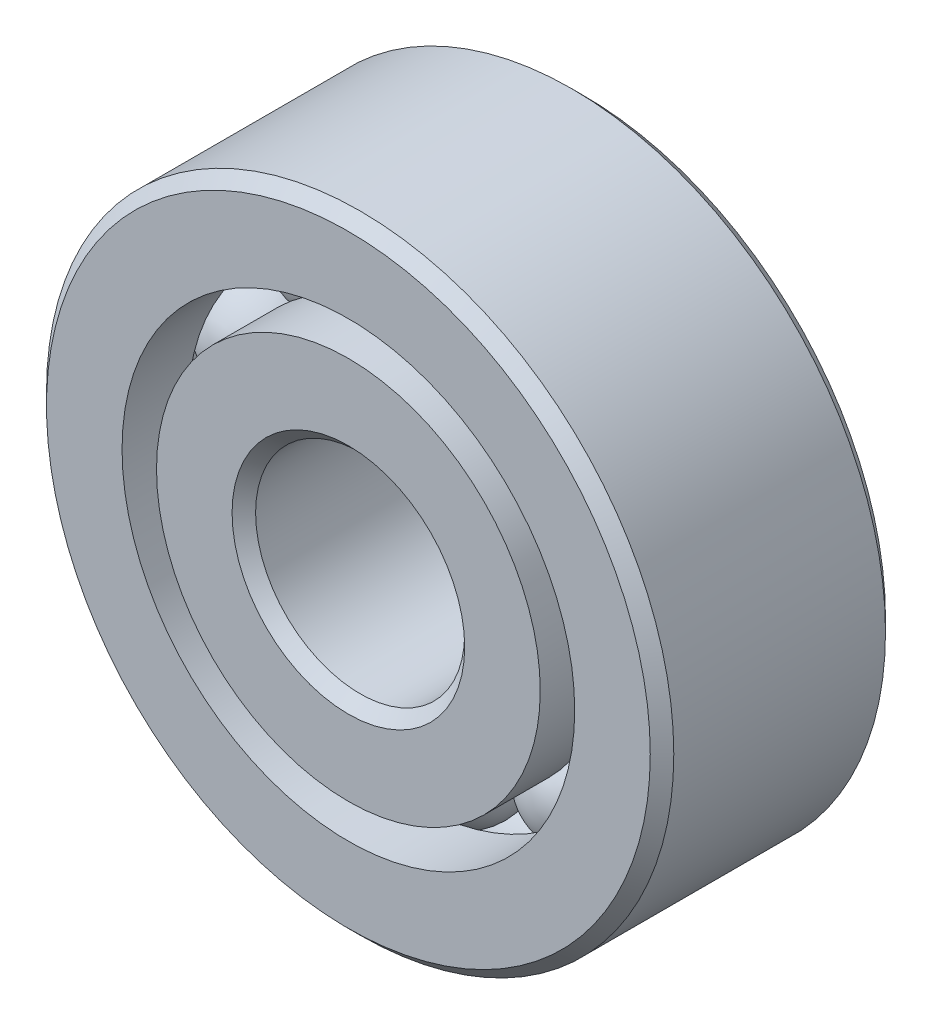
ISO-10303-21;
HEADER;
FILE_DESCRIPTION(('STEP AP214'),'2;1');
FILE_NAME('part.step','',(''),(''),'','','');
FILE_SCHEMA(('AUTOMOTIVE_DESIGN { 1 0 10303 214 1 1 1 1 }'));
ENDSEC;
DATA;
#1=APPLICATION_CONTEXT('core data for automotive mechanical design processes');
#2=APPLICATION_PROTOCOL_DEFINITION('international standard','automotive_design',2000,#1);
#3=PRODUCT_CONTEXT('',#1,'mechanical');
#4=PRODUCT('Part','Part','',(#3));
#5=PRODUCT_RELATED_PRODUCT_CATEGORY('part','',(#4));
#6=PRODUCT_DEFINITION_FORMATION('','',#4);
#7=PRODUCT_DEFINITION_CONTEXT('part definition',#1,'design');
#8=PRODUCT_DEFINITION('design','',#6,#7);
#9=PRODUCT_DEFINITION_SHAPE('','',#8);
#10=(LENGTH_UNIT() NAMED_UNIT(*) SI_UNIT(.MILLI.,.METRE.));
#11=(NAMED_UNIT(*) PLANE_ANGLE_UNIT() SI_UNIT($,.RADIAN.));
#12=(NAMED_UNIT(*) SI_UNIT($,.STERADIAN.) SOLID_ANGLE_UNIT());
#13=UNCERTAINTY_MEASURE_WITH_UNIT(LENGTH_MEASURE(1.E-05),#10,'distance_accuracy_value','');
#14=(GEOMETRIC_REPRESENTATION_CONTEXT(3) GLOBAL_UNCERTAINTY_ASSIGNED_CONTEXT((#13)) GLOBAL_UNIT_ASSIGNED_CONTEXT((#10,
#11,#12)) REPRESENTATION_CONTEXT('',''));
#15=CARTESIAN_POINT('',(0.,0.,0.));
#16=DIRECTION('',(0.,0.,1.));
#17=DIRECTION('',(1.,0.,0.));
#18=AXIS2_PLACEMENT_3D('',#15,#16,#17);
#19=CARTESIAN_POINT('',(-3.73243635205714,5.13725791428097,0.));
#20=DIRECTION('',(0.,0.,1.));
#21=DIRECTION('',(-0.587785252292462,0.809016994374955,0.));
#22=AXIS2_PLACEMENT_3D('',#19,#20,#21);
#23=SPHERICAL_SURFACE('',#22,1.67154216154795);
#24=CARTESIAN_POINT('',(-3.73243635205714,5.13725791428097,1.67154216154795));
#25=VERTEX_POINT('',#24);
#26=VERTEX_LOOP('',#25);
#27=FACE_BOUND('',#26,.T.);
#28=ADVANCED_FACE('F37',(#27),#23,.T.);
#29=CLOSED_SHELL('',(#28));
#30=MANIFOLD_SOLID_BREP('B2',#29);
#31=CARTESIAN_POINT('',(-6.0392088784742,1.96225791428099,0.));
#32=DIRECTION('',(0.,0.,1.));
#33=DIRECTION('',(-0.95105651629515,0.309016994374958,0.));
#34=AXIS2_PLACEMENT_3D('',#31,#32,#33);
#35=SPHERICAL_SURFACE('',#34,1.67154216154795);
#36=CARTESIAN_POINT('',(-6.0392088784742,1.96225791428099,1.67154216154795));
#37=VERTEX_POINT('',#36);
#38=VERTEX_LOOP('',#37);
#39=FACE_BOUND('',#38,.T.);
#40=ADVANCED_FACE('F57',(#39),#35,.T.);
#41=CLOSED_SHELL('',(#40));
#42=MANIFOLD_SOLID_BREP('B6',#41);
#43=CARTESIAN_POINT('',(-6.03920887847425,-1.96225791428086,0.));
#44=DIRECTION('',(0.,0.,1.));
#45=DIRECTION('',(-0.951056516295157,-0.309016994374938,0.));
#46=AXIS2_PLACEMENT_3D('',#43,#44,#45);
#47=SPHERICAL_SURFACE('',#46,1.67154216154795);
#48=CARTESIAN_POINT('',(-6.03920887847425,-1.96225791428086,1.67154216154795));
#49=VERTEX_POINT('',#48);
#50=VERTEX_LOOP('',#49);
#51=FACE_BOUND('',#50,.T.);
#52=ADVANCED_FACE('F77',(#51),#47,.T.);
#53=CLOSED_SHELL('',(#52));
#54=MANIFOLD_SOLID_BREP('B33',#53);
#55=CARTESIAN_POINT('',(-3.73243635205725,-5.13725791428089,0.));
#56=DIRECTION('',(0.,0.,1.));
#57=DIRECTION('',(-0.58778525229248,-0.809016994374942,0.));
#58=AXIS2_PLACEMENT_3D('',#55,#56,#57);
#59=SPHERICAL_SURFACE('',#58,1.67154216154795);
#60=CARTESIAN_POINT('',(-3.73243635205725,-5.13725791428089,1.67154216154795));
#61=VERTEX_POINT('',#60);
#62=VERTEX_LOOP('',#61);
#63=FACE_BOUND('',#62,.T.);
#64=ADVANCED_FACE('F97',(#63),#59,.T.);
#65=CLOSED_SHELL('',(#64));
#66=MANIFOLD_SOLID_BREP('B53',#65);
#67=CARTESIAN_POINT('',(0.,-6.35,0.));
#68=DIRECTION('',(0.,0.,1.));
#69=DIRECTION('',(0.,-1.,0.));
#70=AXIS2_PLACEMENT_3D('',#67,#68,#69);
#71=SPHERICAL_SURFACE('',#70,1.67154216154795);
#72=CARTESIAN_POINT('',(0.,-6.35,1.67154216154795));
#73=VERTEX_POINT('',#72);
#74=VERTEX_LOOP('',#73);
#75=FACE_BOUND('',#74,.T.);
#76=ADVANCED_FACE('F117',(#75),#71,.T.);
#77=CLOSED_SHELL('',(#76));
#78=MANIFOLD_SOLID_BREP('B73',#77);
#79=CARTESIAN_POINT('',(3.73243635205718,-5.13725791428094,0.));
#80=DIRECTION('',(0.,0.,1.));
#81=DIRECTION('',(0.587785252292469,-0.809016994374951,0.));
#82=AXIS2_PLACEMENT_3D('',#79,#80,#81);
#83=SPHERICAL_SURFACE('',#82,1.67154216154795);
#84=CARTESIAN_POINT('',(3.73243635205718,-5.13725791428094,1.67154216154795));
#85=VERTEX_POINT('',#84);
#86=VERTEX_LOOP('',#85);
#87=FACE_BOUND('',#86,.T.);
#88=ADVANCED_FACE('F137',(#87),#83,.T.);
#89=CLOSED_SHELL('',(#88));
#90=MANIFOLD_SOLID_BREP('B93',#89);
#91=CARTESIAN_POINT('',(6.03920887847422,-1.96225791428094,0.));
#92=DIRECTION('',(0.,0.,1.));
#93=DIRECTION('',(0.951056516295152,-0.309016994374952,0.));
#94=AXIS2_PLACEMENT_3D('',#91,#92,#93);
#95=SPHERICAL_SURFACE('',#94,1.67154216154795);
#96=CARTESIAN_POINT('',(6.03920887847422,-1.96225791428094,1.67154216154795));
#97=VERTEX_POINT('',#96);
#98=VERTEX_LOOP('',#97);
#99=FACE_BOUND('',#98,.T.);
#100=ADVANCED_FACE('F157',(#99),#95,.T.);
#101=CLOSED_SHELL('',(#100));
#102=MANIFOLD_SOLID_BREP('B113',#101);
#103=CARTESIAN_POINT('',(6.03920887847423,1.9622579142809,0.));
#104=DIRECTION('',(0.,0.,1.));
#105=DIRECTION('',(0.951056516295155,0.309016994374945,0.));
#106=AXIS2_PLACEMENT_3D('',#103,#104,#105);
#107=SPHERICAL_SURFACE('',#106,1.67154216154795);
#108=CARTESIAN_POINT('',(6.03920887847423,1.9622579142809,1.67154216154795));
#109=VERTEX_POINT('',#108);
#110=VERTEX_LOOP('',#109);
#111=FACE_BOUND('',#110,.T.);
#112=ADVANCED_FACE('F177',(#111),#107,.T.);
#113=CLOSED_SHELL('',(#112));
#114=MANIFOLD_SOLID_BREP('B133',#113);
#115=CARTESIAN_POINT('',(3.73243635205721,5.13725791428091,0.));
#116=DIRECTION('',(0.,0.,1.));
#117=DIRECTION('',(0.587785252292474,0.809016994374947,0.));
#118=AXIS2_PLACEMENT_3D('',#115,#116,#117);
#119=SPHERICAL_SURFACE('',#118,1.67154216154795);
#120=CARTESIAN_POINT('',(3.73243635205721,5.13725791428091,1.67154216154795));
#121=VERTEX_POINT('',#120);
#122=VERTEX_LOOP('',#121);
#123=FACE_BOUND('',#122,.T.);
#124=ADVANCED_FACE('F197',(#123),#119,.T.);
#125=CLOSED_SHELL('',(#124));
#126=MANIFOLD_SOLID_BREP('B153',#125);
#127=CARTESIAN_POINT('',(0.,6.35,0.));
#128=DIRECTION('',(0.,0.,1.));
#129=DIRECTION('',(0.,1.,0.));
#130=AXIS2_PLACEMENT_3D('',#127,#128,#129);
#131=SPHERICAL_SURFACE('',#130,1.67154216154795);
#132=CARTESIAN_POINT('',(0.,6.35,1.67154216154795));
#133=VERTEX_POINT('',#132);
#134=VERTEX_LOOP('',#133);
#135=FACE_BOUND('',#134,.T.);
#136=ADVANCED_FACE('F220',(#135),#131,.T.);
#137=CLOSED_SHELL('',(#136));
#138=MANIFOLD_SOLID_BREP('B173',#137);
#139=CARTESIAN_POINT('',(0.,5.82664835164835,3.571875));
#140=DIRECTION('',(0.,0.,-1.));
#141=DIRECTION('',(-1.,0.,0.));
#142=AXIS2_PLACEMENT_3D('',#139,#140,#141);
#143=PLANE('',#142);
#144=CARTESIAN_POINT('',(0.,0.,3.571875));
#145=DIRECTION('',(0.,0.,1.));
#146=DIRECTION('',(1.,0.,0.));
#147=AXIS2_PLACEMENT_3D('',#144,#145,#146);
#148=CIRCLE('',#147,3.5321875);
#149=CARTESIAN_POINT('',(3.5321875,0.,3.571875));
#150=VERTEX_POINT('',#149);
#151=EDGE_CURVE('E268',#150,#150,#148,.T.);
#152=ORIENTED_EDGE('',*,*,#151,.F.);
#153=EDGE_LOOP('',(#152));
#154=FACE_BOUND('',#153,.T.);
#155=CARTESIAN_POINT('',(0.,0.,3.571875));
#156=DIRECTION('',(0.,0.,1.));
#157=DIRECTION('',(1.,0.,0.));
#158=AXIS2_PLACEMENT_3D('',#155,#156,#157);
#159=CIRCLE('',#158,5.82664835164835);
#160=CARTESIAN_POINT('',(5.82664835164835,0.,3.571875));
#161=VERTEX_POINT('',#160);
#162=EDGE_CURVE('E219',#161,#161,#159,.T.);
#163=ORIENTED_EDGE('',*,*,#162,.T.);
#164=EDGE_LOOP('',(#163));
#165=FACE_BOUND('',#164,.T.);
#166=ADVANCED_FACE('F240',(#154,#165),#143,.F.);
#167=CARTESIAN_POINT('',(0.,0.,3.571875));
#168=DIRECTION('',(0.,0.,1.));
#169=DIRECTION('',(1.,0.,0.));
#170=AXIS2_PLACEMENT_3D('',#167,#168,#169);
#171=CYLINDRICAL_SURFACE('',#170,5.82664835164835);
#172=ORIENTED_EDGE('',*,*,#162,.F.);
#173=EDGE_LOOP('',(#172));
#174=FACE_BOUND('',#173,.T.);
#175=CARTESIAN_POINT('',(0.,0.,1.5875));
#176=DIRECTION('',(0.,0.,1.));
#177=DIRECTION('',(1.,0.,0.));
#178=AXIS2_PLACEMENT_3D('',#175,#176,#177);
#179=CIRCLE('',#178,5.82664835164835);
#180=CARTESIAN_POINT('',(5.82664835164835,0.,1.5875));
#181=VERTEX_POINT('',#180);
#182=EDGE_CURVE('E246',#181,#181,#179,.T.);
#183=ORIENTED_EDGE('',*,*,#182,.T.);
#184=EDGE_LOOP('',(#183));
#185=FACE_BOUND('',#184,.T.);
#186=ADVANCED_FACE('F275',(#174,#185),#171,.T.);
#187=CARTESIAN_POINT('',(0.,0.,0.));
#188=DIRECTION('',(0.,0.,1.));
#189=DIRECTION('',(1.,0.,0.));
#190=AXIS2_PLACEMENT_3D('',#187,#188,#189);
#191=TOROIDAL_SURFACE('',#190,6.34999999999999,1.67154216154794);
#192=ORIENTED_EDGE('',*,*,#182,.F.);
#193=EDGE_LOOP('',(#192));
#194=FACE_BOUND('',#193,.T.);
#195=CARTESIAN_POINT('',(0.,0.,-1.5875));
#196=DIRECTION('',(0.,0.,1.));
#197=DIRECTION('',(1.,0.,0.));
#198=AXIS2_PLACEMENT_3D('',#195,#196,#197);
#199=CIRCLE('',#198,5.82664835164835);
#200=CARTESIAN_POINT('',(5.82664835164835,0.,-1.5875));
#201=VERTEX_POINT('',#200);
#202=EDGE_CURVE('E250',#201,#201,#199,.T.);
#203=ORIENTED_EDGE('',*,*,#202,.T.);
#204=EDGE_LOOP('',(#203));
#205=FACE_BOUND('',#204,.T.);
#206=ADVANCED_FACE('F279',(#194,#205),#191,.F.);
#207=CARTESIAN_POINT('',(0.,0.,3.571875));
#208=DIRECTION('',(0.,0.,1.));
#209=DIRECTION('',(1.,0.,0.));
#210=AXIS2_PLACEMENT_3D('',#207,#208,#209);
#211=CYLINDRICAL_SURFACE('',#210,5.82664835164835);
#212=ORIENTED_EDGE('',*,*,#202,.F.);
#213=EDGE_LOOP('',(#212));
#214=FACE_BOUND('',#213,.T.);
#215=CARTESIAN_POINT('',(0.,0.,-3.571875));
#216=DIRECTION('',(0.,0.,1.));
#217=DIRECTION('',(1.,0.,0.));
#218=AXIS2_PLACEMENT_3D('',#215,#216,#217);
#219=CIRCLE('',#218,5.82664835164835);
#220=CARTESIAN_POINT('',(5.82664835164835,0.,-3.571875));
#221=VERTEX_POINT('',#220);
#222=EDGE_CURVE('E254',#221,#221,#219,.T.);
#223=ORIENTED_EDGE('',*,*,#222,.T.);
#224=EDGE_LOOP('',(#223));
#225=FACE_BOUND('',#224,.T.);
#226=ADVANCED_FACE('F284',(#214,#225),#211,.T.);
#227=CARTESIAN_POINT('',(0.,3.5321875,-3.571875));
#228=DIRECTION('',(0.,0.,1.));
#229=DIRECTION('',(1.,0.,0.));
#230=AXIS2_PLACEMENT_3D('',#227,#228,#229);
#231=PLANE('',#230);
#232=ORIENTED_EDGE('',*,*,#222,.F.);
#233=EDGE_LOOP('',(#232));
#234=FACE_BOUND('',#233,.T.);
#235=CARTESIAN_POINT('',(0.,0.,-3.57187500000001));
#236=DIRECTION('',(0.,0.,1.));
#237=DIRECTION('',(1.,0.,0.));
#238=AXIS2_PLACEMENT_3D('',#235,#236,#237);
#239=CIRCLE('',#238,3.5321875);
#240=CARTESIAN_POINT('',(3.5321875,0.,-3.57187500000001));
#241=VERTEX_POINT('',#240);
#242=EDGE_CURVE('E259',#241,#241,#239,.T.);
#243=ORIENTED_EDGE('',*,*,#242,.T.);
#244=EDGE_LOOP('',(#243));
#245=FACE_BOUND('',#244,.T.);
#246=ADVANCED_FACE('F290',(#234,#245),#231,.F.);
#247=CARTESIAN_POINT('',(0.,0.,-3.2146875));
#248=DIRECTION('',(0.,0.,-1.));
#249=DIRECTION('',(-1.,0.,0.));
#250=AXIS2_PLACEMENT_3D('',#247,#248,#249);
#251=CONICAL_SURFACE('',#250,3.175,0.785398163397445);
#252=ORIENTED_EDGE('',*,*,#242,.F.);
#253=EDGE_LOOP('',(#252));
#254=FACE_BOUND('',#253,.T.);
#255=CARTESIAN_POINT('',(0.,0.,-3.2146875));
#256=DIRECTION('',(0.,0.,1.));
#257=DIRECTION('',(1.,0.,0.));
#258=AXIS2_PLACEMENT_3D('',#255,#256,#257);
#259=CIRCLE('',#258,3.175);
#260=CARTESIAN_POINT('',(3.175,0.,-3.2146875));
#261=VERTEX_POINT('',#260);
#262=EDGE_CURVE('E262',#261,#261,#259,.T.);
#263=ORIENTED_EDGE('',*,*,#262,.T.);
#264=EDGE_LOOP('',(#263));
#265=FACE_BOUND('',#264,.T.);
#266=ADVANCED_FACE('F294',(#254,#265),#251,.F.);
#267=CARTESIAN_POINT('',(0.,0.,3.571875));
#268=DIRECTION('',(0.,0.,1.));
#269=DIRECTION('',(1.,0.,0.));
#270=AXIS2_PLACEMENT_3D('',#267,#268,#269);
#271=CYLINDRICAL_SURFACE('',#270,3.175);
#272=ORIENTED_EDGE('',*,*,#262,.F.);
#273=EDGE_LOOP('',(#272));
#274=FACE_BOUND('',#273,.T.);
#275=CARTESIAN_POINT('',(0.,0.,3.21468750000001));
#276=DIRECTION('',(0.,0.,1.));
#277=DIRECTION('',(1.,0.,0.));
#278=AXIS2_PLACEMENT_3D('',#275,#276,#277);
#279=CIRCLE('',#278,3.175);
#280=CARTESIAN_POINT('',(3.175,0.,3.21468750000001));
#281=VERTEX_POINT('',#280);
#282=EDGE_CURVE('E265',#281,#281,#279,.T.);
#283=ORIENTED_EDGE('',*,*,#282,.T.);
#284=EDGE_LOOP('',(#283));
#285=FACE_BOUND('',#284,.T.);
#286=ADVANCED_FACE('F298',(#274,#285),#271,.F.);
#287=CARTESIAN_POINT('',(0.,0.,3.571875));
#288=DIRECTION('',(0.,0.,1.));
#289=DIRECTION('',(1.,0.,0.));
#290=AXIS2_PLACEMENT_3D('',#287,#288,#289);
#291=CONICAL_SURFACE('',#290,3.5321875,0.785398163397453);
#292=ORIENTED_EDGE('',*,*,#282,.F.);
#293=EDGE_LOOP('',(#292));
#294=FACE_BOUND('',#293,.T.);
#295=ORIENTED_EDGE('',*,*,#151,.T.);
#296=EDGE_LOOP('',(#295));
#297=FACE_BOUND('',#296,.T.);
#298=ADVANCED_FACE('F272',(#294,#297),#291,.F.);
#299=CLOSED_SHELL('',(#166,#186,#206,#226,#246,#266,#286,#298));
#300=MANIFOLD_SOLID_BREP('B193',#299);
#301=CARTESIAN_POINT('',(0.,0.,3.2146875));
#302=DIRECTION('',(0.,0.,-1.));
#303=DIRECTION('',(-1.,0.,0.));
#304=AXIS2_PLACEMENT_3D('',#301,#302,#303);
#305=CONICAL_SURFACE('',#304,9.525,0.785398163397449);
#306=CARTESIAN_POINT('',(0.,0.,3.571875));
#307=DIRECTION('',(0.,0.,1.));
#308=DIRECTION('',(1.,0.,0.));
#309=AXIS2_PLACEMENT_3D('',#306,#307,#308);
#310=CIRCLE('',#309,9.1678125);
#311=CARTESIAN_POINT('',(9.1678125,0.,3.571875));
#312=VERTEX_POINT('',#311);
#313=EDGE_CURVE('E390',#312,#312,#310,.T.);
#314=ORIENTED_EDGE('',*,*,#313,.F.);
#315=EDGE_LOOP('',(#314));
#316=FACE_BOUND('',#315,.T.);
#317=CARTESIAN_POINT('',(0.,0.,3.2146875));
#318=DIRECTION('',(0.,0.,1.));
#319=DIRECTION('',(1.,0.,0.));
#320=AXIS2_PLACEMENT_3D('',#317,#318,#319);
#321=CIRCLE('',#320,9.525);
#322=CARTESIAN_POINT('',(9.525,0.,3.2146875));
#323=VERTEX_POINT('',#322);
#324=EDGE_CURVE('E239',#323,#323,#321,.T.);
#325=ORIENTED_EDGE('',*,*,#324,.T.);
#326=EDGE_LOOP('',(#325));
#327=FACE_BOUND('',#326,.T.);
#328=ADVANCED_FACE('F362',(#316,#327),#305,.T.);
#329=CARTESIAN_POINT('',(0.,0.,3.571875));
#330=DIRECTION('',(0.,0.,1.));
#331=DIRECTION('',(1.,0.,0.));
#332=AXIS2_PLACEMENT_3D('',#329,#330,#331);
#333=CYLINDRICAL_SURFACE('',#332,9.525);
#334=ORIENTED_EDGE('',*,*,#324,.F.);
#335=EDGE_LOOP('',(#334));
#336=FACE_BOUND('',#335,.T.);
#337=CARTESIAN_POINT('',(0.,0.,-3.2146875));
#338=DIRECTION('',(0.,0.,1.));
#339=DIRECTION('',(1.,0.,0.));
#340=AXIS2_PLACEMENT_3D('',#337,#338,#339);
#341=CIRCLE('',#340,9.525);
#342=CARTESIAN_POINT('',(9.525,0.,-3.2146875));
#343=VERTEX_POINT('',#342);
#344=EDGE_CURVE('E368',#343,#343,#341,.T.);
#345=ORIENTED_EDGE('',*,*,#344,.T.);
#346=EDGE_LOOP('',(#345));
#347=FACE_BOUND('',#346,.T.);
#348=ADVANCED_FACE('F397',(#336,#347),#333,.T.);
#349=CARTESIAN_POINT('',(0.,0.,-3.57187500000001));
#350=DIRECTION('',(0.,0.,1.));
#351=DIRECTION('',(1.,0.,0.));
#352=AXIS2_PLACEMENT_3D('',#349,#350,#351);
#353=CONICAL_SURFACE('',#352,9.1678125,0.785398163397445);
#354=ORIENTED_EDGE('',*,*,#344,.F.);
#355=EDGE_LOOP('',(#354));
#356=FACE_BOUND('',#355,.T.);
#357=CARTESIAN_POINT('',(0.,0.,-3.57187500000001));
#358=DIRECTION('',(0.,0.,1.));
#359=DIRECTION('',(1.,0.,0.));
#360=AXIS2_PLACEMENT_3D('',#357,#358,#359);
#361=CIRCLE('',#360,9.1678125);
#362=CARTESIAN_POINT('',(9.1678125,0.,-3.57187500000001));
#363=VERTEX_POINT('',#362);
#364=EDGE_CURVE('E372',#363,#363,#361,.T.);
#365=ORIENTED_EDGE('',*,*,#364,.T.);
#366=EDGE_LOOP('',(#365));
#367=FACE_BOUND('',#366,.T.);
#368=ADVANCED_FACE('F401',(#356,#367),#353,.T.);
#369=CARTESIAN_POINT('',(0.,9.1678125,-3.571875));
#370=DIRECTION('',(0.,0.,1.));
#371=DIRECTION('',(1.,0.,0.));
#372=AXIS2_PLACEMENT_3D('',#369,#370,#371);
#373=PLANE('',#372);
#374=ORIENTED_EDGE('',*,*,#364,.F.);
#375=EDGE_LOOP('',(#374));
#376=FACE_BOUND('',#375,.T.);
#377=CARTESIAN_POINT('',(0.,0.,-3.571875));
#378=DIRECTION('',(0.,0.,1.));
#379=DIRECTION('',(1.,0.,0.));
#380=AXIS2_PLACEMENT_3D('',#377,#378,#379);
#381=CIRCLE('',#380,6.87335164835165);
#382=CARTESIAN_POINT('',(6.87335164835165,0.,-3.571875));
#383=VERTEX_POINT('',#382);
#384=EDGE_CURVE('E376',#383,#383,#381,.T.);
#385=ORIENTED_EDGE('',*,*,#384,.T.);
#386=EDGE_LOOP('',(#385));
#387=FACE_BOUND('',#386,.T.);
#388=ADVANCED_FACE('F406',(#376,#387),#373,.F.);
#389=CARTESIAN_POINT('',(0.,0.,3.571875));
#390=DIRECTION('',(0.,0.,1.));
#391=DIRECTION('',(1.,0.,0.));
#392=AXIS2_PLACEMENT_3D('',#389,#390,#391);
#393=CYLINDRICAL_SURFACE('',#392,6.87335164835165);
#394=ORIENTED_EDGE('',*,*,#384,.F.);
#395=EDGE_LOOP('',(#394));
#396=FACE_BOUND('',#395,.T.);
#397=CARTESIAN_POINT('',(0.,0.,-1.5875));
#398=DIRECTION('',(0.,0.,1.));
#399=DIRECTION('',(1.,0.,0.));
#400=AXIS2_PLACEMENT_3D('',#397,#398,#399);
#401=CIRCLE('',#400,6.87335164835165);
#402=CARTESIAN_POINT('',(6.87335164835165,0.,-1.5875));
#403=VERTEX_POINT('',#402);
#404=EDGE_CURVE('E381',#403,#403,#401,.T.);
#405=ORIENTED_EDGE('',*,*,#404,.T.);
#406=EDGE_LOOP('',(#405));
#407=FACE_BOUND('',#406,.T.);
#408=ADVANCED_FACE('F412',(#396,#407),#393,.F.);
#409=CARTESIAN_POINT('',(0.,0.,0.));
#410=DIRECTION('',(0.,0.,1.));
#411=DIRECTION('',(1.,0.,0.));
#412=AXIS2_PLACEMENT_3D('',#409,#410,#411);
#413=TOROIDAL_SURFACE('',#412,6.35,1.67154216154795);
#414=ORIENTED_EDGE('',*,*,#404,.F.);
#415=EDGE_LOOP('',(#414));
#416=FACE_BOUND('',#415,.T.);
#417=CARTESIAN_POINT('',(0.,0.,1.5875));
#418=DIRECTION('',(0.,0.,1.));
#419=DIRECTION('',(1.,0.,0.));
#420=AXIS2_PLACEMENT_3D('',#417,#418,#419);
#421=CIRCLE('',#420,6.87335164835165);
#422=CARTESIAN_POINT('',(6.87335164835165,0.,1.5875));
#423=VERTEX_POINT('',#422);
#424=EDGE_CURVE('E384',#423,#423,#421,.T.);
#425=ORIENTED_EDGE('',*,*,#424,.T.);
#426=EDGE_LOOP('',(#425));
#427=FACE_BOUND('',#426,.T.);
#428=ADVANCED_FACE('F416',(#416,#427),#413,.F.);
#429=CARTESIAN_POINT('',(0.,0.,3.571875));
#430=DIRECTION('',(0.,0.,1.));
#431=DIRECTION('',(1.,0.,0.));
#432=AXIS2_PLACEMENT_3D('',#429,#430,#431);
#433=CYLINDRICAL_SURFACE('',#432,6.87335164835165);
#434=ORIENTED_EDGE('',*,*,#424,.F.);
#435=EDGE_LOOP('',(#434));
#436=FACE_BOUND('',#435,.T.);
#437=CARTESIAN_POINT('',(0.,0.,3.571875));
#438=DIRECTION('',(0.,0.,1.));
#439=DIRECTION('',(1.,0.,0.));
#440=AXIS2_PLACEMENT_3D('',#437,#438,#439);
#441=CIRCLE('',#440,6.87335164835165);
#442=CARTESIAN_POINT('',(6.87335164835165,0.,3.571875));
#443=VERTEX_POINT('',#442);
#444=EDGE_CURVE('E387',#443,#443,#441,.T.);
#445=ORIENTED_EDGE('',*,*,#444,.T.);
#446=EDGE_LOOP('',(#445));
#447=FACE_BOUND('',#446,.T.);
#448=ADVANCED_FACE('F420',(#436,#447),#433,.F.);
#449=CARTESIAN_POINT('',(0.,9.1678125,3.571875));
#450=DIRECTION('',(0.,0.,-1.));
#451=DIRECTION('',(-1.,0.,0.));
#452=AXIS2_PLACEMENT_3D('',#449,#450,#451);
#453=PLANE('',#452);
#454=ORIENTED_EDGE('',*,*,#444,.F.);
#455=EDGE_LOOP('',(#454));
#456=FACE_BOUND('',#455,.T.);
#457=ORIENTED_EDGE('',*,*,#313,.T.);
#458=EDGE_LOOP('',(#457));
#459=FACE_BOUND('',#458,.T.);
#460=ADVANCED_FACE('F394',(#456,#459),#453,.F.);
#461=CLOSED_SHELL('',(#328,#348,#368,#388,#408,#428,#448,#460));
#462=MANIFOLD_SOLID_BREP('B214',#461);
#463=ADVANCED_BREP_SHAPE_REPRESENTATION('',(#18,#30,#42,#54,#66,#78,#90,#102,#114,#126,#138,
#300,#462),#14);
#464=SHAPE_DEFINITION_REPRESENTATION(#9,#463);
ENDSEC;
END-ISO-10303-21;
